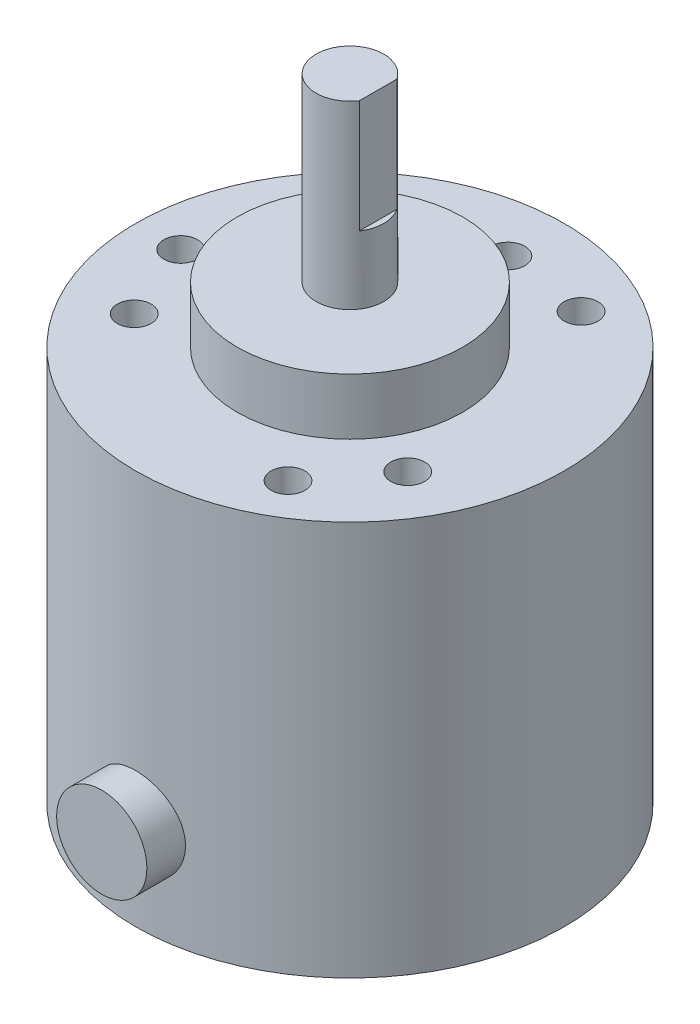
ISO-10303-21;
HEADER;
FILE_DESCRIPTION(('STEP AP214'),'2;1');
FILE_NAME('part.step','',(''),(''),'','','');
FILE_SCHEMA(('AUTOMOTIVE_DESIGN { 1 0 10303 214 1 1 1 1 }'));
ENDSEC;
DATA;
#1=APPLICATION_CONTEXT('core data for automotive mechanical design processes');
#2=APPLICATION_PROTOCOL_DEFINITION('international standard','automotive_design',2000,#1);
#3=PRODUCT_CONTEXT('',#1,'mechanical');
#4=PRODUCT('Part','Part','',(#3));
#5=PRODUCT_RELATED_PRODUCT_CATEGORY('part','',(#4));
#6=PRODUCT_DEFINITION_FORMATION('','',#4);
#7=PRODUCT_DEFINITION_CONTEXT('part definition',#1,'design');
#8=PRODUCT_DEFINITION('design','',#6,#7);
#9=PRODUCT_DEFINITION_SHAPE('','',#8);
#10=(LENGTH_UNIT() NAMED_UNIT(*) SI_UNIT(.MILLI.,.METRE.));
#11=(NAMED_UNIT(*) PLANE_ANGLE_UNIT() SI_UNIT($,.RADIAN.));
#12=(NAMED_UNIT(*) SI_UNIT($,.STERADIAN.) SOLID_ANGLE_UNIT());
#13=UNCERTAINTY_MEASURE_WITH_UNIT(LENGTH_MEASURE(1.E-05),#10,'distance_accuracy_value','');
#14=(GEOMETRIC_REPRESENTATION_CONTEXT(3) GLOBAL_UNCERTAINTY_ASSIGNED_CONTEXT((#13)) GLOBAL_UNIT_ASSIGNED_CONTEXT((#10,
#11,#12)) REPRESENTATION_CONTEXT('',''));
#15=CARTESIAN_POINT('',(0.,0.,0.));
#16=DIRECTION('',(0.,0.,1.));
#17=DIRECTION('',(1.,0.,0.));
#18=AXIS2_PLACEMENT_3D('',#15,#16,#17);
#19=CARTESIAN_POINT('',(0.,-35.,0.));
#20=DIRECTION('',(0.,1.,0.));
#21=DIRECTION('',(0.,0.,1.));
#22=AXIS2_PLACEMENT_3D('',#19,#20,#21);
#23=CYLINDRICAL_SURFACE('',#22,19.);
#24=CARTESIAN_POINT('',(0.,0.,0.));
#25=DIRECTION('',(0.,1.,0.));
#26=DIRECTION('',(0.,0.,1.));
#27=AXIS2_PLACEMENT_3D('',#24,#25,#26);
#28=CIRCLE('',#27,19.);
#29=CARTESIAN_POINT('',(0.,0.,19.));
#30=VERTEX_POINT('',#29);
#31=EDGE_CURVE('E100',#30,#30,#28,.T.);
#32=ORIENTED_EDGE('',*,*,#31,.F.);
#33=EDGE_LOOP('',(#32));
#34=FACE_BOUND('',#33,.T.);
#35=CARTESIAN_POINT('',(0.,-35.,0.));
#36=DIRECTION('',(0.,1.,0.));
#37=DIRECTION('',(0.,0.,1.));
#38=AXIS2_PLACEMENT_3D('',#35,#36,#37);
#39=CIRCLE('',#38,19.);
#40=CARTESIAN_POINT('',(0.,-35.,19.));
#41=VERTEX_POINT('',#40);
#42=EDGE_CURVE('E111',#41,#41,#39,.T.);
#43=ORIENTED_EDGE('',*,*,#42,.T.);
#44=EDGE_LOOP('',(#43));
#45=FACE_BOUND('',#44,.T.);
#46=CARTESIAN_POINT('',(0.,-31.,19.));
#47=CARTESIAN_POINT('',(-0.222055382813836,-30.9999921424837,18.9999958893257));
#48=CARTESIAN_POINT('',(-0.444207639395813,-30.9814468251699,18.996067480223));
#49=CARTESIAN_POINT('',(-0.882215795355482,-30.9078244315504,18.9807754775309));
#50=CARTESIAN_POINT('',(-1.09806684309606,-30.8527199425833,18.9694063048226));
#51=CARTESIAN_POINT('',(-1.51707790871326,-30.7077706493815,18.9405002887392));
#52=CARTESIAN_POINT('',(-1.72025045450495,-30.6179607904962,18.9229696510356));
#53=CARTESIAN_POINT('',(-2.10863339112694,-30.4062579201912,18.8836388783474));
#54=CARTESIAN_POINT('',(-2.29384451534851,-30.2843662194756,18.8618389177952));
#55=CARTESIAN_POINT('',(-2.64382211329557,-30.0100326328436,18.8159987980037));
#56=CARTESIAN_POINT('',(-2.80828196955391,-29.8572039029418,18.7919325734539));
#57=CARTESIAN_POINT('',(-3.10943160183122,-29.5261654962331,18.7444586505301));
#58=CARTESIAN_POINT('',(-3.2461190435998,-29.3479536881373,18.7210510076518));
#59=CARTESIAN_POINT('',(-3.48917522663028,-28.9689683719067,18.6772887116273));
#60=CARTESIAN_POINT('',(-3.59522154866623,-28.7679838775135,18.6569675220811));
#61=CARTESIAN_POINT('',(-3.77191825818649,-28.3505496030705,18.6220513911507));
#62=CARTESIAN_POINT('',(-3.84257254527847,-28.1341015298517,18.607455818938));
#63=CARTESIAN_POINT('',(-3.94547423596825,-27.6951983758734,18.5859082009251));
#64=CARTESIAN_POINT('',(-3.97826234299207,-27.4728754520748,18.5788486590822));
#65=CARTESIAN_POINT('',(-4.00618140253168,-27.0257808194625,18.5728492573137));
#66=CARTESIAN_POINT('',(-4.00131663256248,-26.8010093917057,18.5739084750649));
#67=CARTESIAN_POINT('',(-3.95450406930534,-26.3593890862353,18.583929433905));
#68=CARTESIAN_POINT('',(-3.91318065931278,-26.1424705490151,18.5927581103508));
#69=CARTESIAN_POINT('',(-3.79561141204452,-25.718715573759,18.6171132262784));
#70=CARTESIAN_POINT('',(-3.7193637454707,-25.5118796644692,18.6326400165983));
#71=CARTESIAN_POINT('',(-3.53352685048917,-25.1123862317378,18.6687752085924));
#72=CARTESIAN_POINT('',(-3.42369423166177,-24.9198454034266,18.6894204901852));
#73=CARTESIAN_POINT('',(-3.17397657448484,-24.5556944147395,18.7334433759803));
#74=CARTESIAN_POINT('',(-3.03408772641144,-24.3840869120572,18.7568213263859));
#75=CARTESIAN_POINT('',(-2.72490638537109,-24.0630754365034,18.8042488683663));
#76=CARTESIAN_POINT('',(-2.55508206157721,-23.9141838274458,18.8283025447517));
#77=CARTESIAN_POINT('',(-2.19260701237293,-23.6469149885702,18.873944715442));
#78=CARTESIAN_POINT('',(-1.99995593040768,-23.528538235487,18.8955331712296));
#79=CARTESIAN_POINT('',(-1.59669589320591,-23.3255471413451,18.9338746434493));
#80=CARTESIAN_POINT('',(-1.38605416097403,-23.2409960909265,18.9506185793451));
#81=CARTESIAN_POINT('',(-0.953123444845402,-23.1086282233457,18.9773163519414));
#82=CARTESIAN_POINT('',(-0.730836031740074,-23.0608064656238,18.987271101854));
#83=CARTESIAN_POINT('',(-0.285322358287668,-23.0039909872077,18.9991401442735));
#84=CARTESIAN_POINT('',(-0.0621891762186728,-22.9942968056736,19.0011994695835));
#85=CARTESIAN_POINT('',(0.382508336009774,-23.0121185393307,18.997450449021));
#86=CARTESIAN_POINT('',(0.604072763492887,-23.0396321254991,18.9916425955951));
#87=CARTESIAN_POINT('',(1.03704990387805,-23.1305070081485,18.9729029753973));
#88=CARTESIAN_POINT('',(1.24854238337961,-23.1935044862496,18.9600435437171));
#89=CARTESIAN_POINT('',(1.65796032712833,-23.353157872429,18.9286386979287));
#90=CARTESIAN_POINT('',(1.8558846943375,-23.4498164983177,18.91009282471));
#91=CARTESIAN_POINT('',(2.23547042782498,-23.6755328256164,18.869012787005));
#92=CARTESIAN_POINT('',(2.41687884164439,-23.8050066120728,18.8464285922688));
#93=CARTESIAN_POINT('',(2.75564561874648,-24.0921259709389,18.799885845297));
#94=CARTESIAN_POINT('',(2.91300109975833,-24.2497749146847,18.7759271288244));
#95=CARTESIAN_POINT('',(3.201935237809,-24.5919727155078,18.7288400533491));
#96=CARTESIAN_POINT('',(3.33303066599124,-24.7769329971137,18.7057327105623));
#97=CARTESIAN_POINT('',(3.5622974306445,-25.1666584386008,18.6634317231936));
#98=CARTESIAN_POINT('',(3.66047015053673,-25.3714227658445,18.6442379141773));
#99=CARTESIAN_POINT('',(3.82046809790262,-25.7938700942725,18.6121113785543));
#100=CARTESIAN_POINT('',(3.88249139206334,-26.0114753643481,18.5991446035873));
#101=CARTESIAN_POINT('',(3.96901995121824,-26.4543246385849,18.5808738151247));
#102=CARTESIAN_POINT('',(3.99353071271758,-26.6795675187044,18.5755686790177));
#103=CARTESIAN_POINT('',(4.00411803678917,-27.1264354540013,18.5732888386761));
#104=CARTESIAN_POINT('',(3.99095955808213,-27.3480418873506,18.576148330205));
#105=CARTESIAN_POINT('',(3.92828225656662,-27.7858051398868,18.589502601972));
#106=CARTESIAN_POINT('',(3.87876379872269,-28.0019620137514,18.5999973055712));
#107=CARTESIAN_POINT('',(3.7451292661544,-28.4221367691109,18.6273616503272));
#108=CARTESIAN_POINT('',(3.66111668433852,-28.6261888903993,18.6442122097795));
#109=CARTESIAN_POINT('',(3.46097067460855,-29.0174180661529,18.6823985618686));
#110=CARTESIAN_POINT('',(3.34483418824594,-29.2045935115748,18.7037347815292));
#111=CARTESIAN_POINT('',(3.08116600704923,-29.5605443062738,18.7489890956385));
#112=CARTESIAN_POINT('',(2.93308584847833,-29.7289082548408,18.7729481409154));
#113=CARTESIAN_POINT('',(2.61085484825932,-30.0386494217784,18.8204651322459));
#114=CARTESIAN_POINT('',(2.43669800852824,-30.180020414241,18.8440229846262));
#115=CARTESIAN_POINT('',(2.0647779741216,-30.4333539965082,18.8884129022144));
#116=CARTESIAN_POINT('',(1.86675996870868,-30.5449490336213,18.909209437839));
#117=CARTESIAN_POINT('',(1.45438907613669,-30.7330980359579,18.9453803674082));
#118=CARTESIAN_POINT('',(1.24005053974158,-30.8096823805881,18.9607594594965));
#119=CARTESIAN_POINT('',(0.854478514211865,-30.9114533885606,18.981508741389));
#120=CARTESIAN_POINT('',(0.685381801359018,-30.9445969016263,18.9884010859942));
#121=CARTESIAN_POINT('',(0.34420938671229,-30.9888728301902,18.9976482214323));
#122=CARTESIAN_POINT('',(0.172133799582145,-31.0000060910216,19.0000031865293));
#123=CARTESIAN_POINT('',(0.,-31.,19.));
#124=B_SPLINE_CURVE_WITH_KNOTS('',3,(#46,#47,#48,#49,#50,#51,#52,#53,#54,#55,#56,#57,#58,#59,
#60,#61,#62,#63,#64,#65,#66,#67,#68,#69,#70,#71,#72,#73,#74,#75,#76,#77,#78,#79,#80,#81,#82,#83,
#84,#85,#86,#87,#88,#89,#90,#91,#92,#93,#94,#95,#96,#97,#98,#99,#100,#101,#102,#103,#104,#105,
#106,#107,#108,#109,#110,#111,#112,#113,#114,#115,#116,#117,#118,#119,#120,#121,#122,#123),
.UNSPECIFIED.,.T.,.F.,(4,2,2,2,2,2,2,2,2,2,2,2,2,2,2,2,2,2,2,2,2,2,2,2,2,2,2,2,2,2,2,2,2,2,2,2,
2,2,4),(0.,0.665536234062554,1.33157206286139,1.99693899051184,2.66227873880329,3.3365183946508,
4.0108146964097,4.69196738164773,5.37304499878556,6.04427211507891,6.71542297844931,
7.37529822854114,8.03520804620082,8.7000183684136,9.36491300724142,10.0430975373678,
10.7212926621599,11.4007508759998,12.080117678007,12.7469435233153,13.4137276305458,
14.0737964538715,14.7339185836982,15.4028707046387,16.0719029235962,16.7522989553899,
17.4326663931731,18.1092701011708,18.7857746606523,19.4486393151671,20.111497316246,
20.7723809072781,21.4333274412995,22.1066821923303,22.7801920650891,23.4616668159212,
24.1425491112116,24.658482025837,25.1743951249796),.UNSPECIFIED.);
#125=CARTESIAN_POINT('',(0.,-31.,19.));
#126=VERTEX_POINT('',#125);
#127=EDGE_CURVE('E51',#126,#126,#124,.T.);
#128=ORIENTED_EDGE('',*,*,#127,.T.);
#129=EDGE_LOOP('',(#128));
#130=FACE_BOUND('',#129,.T.);
#131=ADVANCED_FACE('F47',(#34,#45,#130),#23,.T.);
#132=CARTESIAN_POINT('',(0.,-35.,0.));
#133=DIRECTION('',(0.,1.,0.));
#134=DIRECTION('',(0.,0.,1.));
#135=AXIS2_PLACEMENT_3D('',#132,#133,#134);
#136=PLANE('',#135);
#137=ORIENTED_EDGE('',*,*,#42,.F.);
#138=EDGE_LOOP('',(#137));
#139=FACE_BOUND('',#138,.T.);
#140=ADVANCED_FACE('F123',(#139),#136,.F.);
#141=CARTESIAN_POINT('',(0.,0.,0.));
#142=DIRECTION('',(0.,1.,0.));
#143=DIRECTION('',(0.,0.,1.));
#144=AXIS2_PLACEMENT_3D('',#141,#142,#143);
#145=PLANE('',#144);
#146=CARTESIAN_POINT('',(7.49999999999988,0.,12.9903810567667));
#147=DIRECTION('',(0.,1.,0.));
#148=DIRECTION('',(0.,0.,1.));
#149=AXIS2_PLACEMENT_3D('',#146,#147,#148);
#150=CIRCLE('',#149,1.5);
#151=CARTESIAN_POINT('',(7.49999999999988,0.,14.4903810567667));
#152=VERTEX_POINT('',#151);
#153=EDGE_CURVE('E135',#152,#152,#150,.T.);
#154=ORIENTED_EDGE('',*,*,#153,.F.);
#155=EDGE_LOOP('',(#154));
#156=FACE_BOUND('',#155,.T.);
#157=CARTESIAN_POINT('',(12.1243556529821,0.,7.));
#158=DIRECTION('',(0.,1.,0.));
#159=DIRECTION('',(0.,0.,1.));
#160=AXIS2_PLACEMENT_3D('',#157,#158,#159);
#161=CIRCLE('',#160,1.50000000000006);
#162=CARTESIAN_POINT('',(12.1243556529821,0.,8.50000000000006));
#163=VERTEX_POINT('',#162);
#164=EDGE_CURVE('E167',#163,#163,#161,.T.);
#165=ORIENTED_EDGE('',*,*,#164,.F.);
#166=EDGE_LOOP('',(#165));
#167=FACE_BOUND('',#166,.T.);
#168=CARTESIAN_POINT('',(7.50000000000006,0.,-12.9903810567665));
#169=DIRECTION('',(0.,1.,0.));
#170=DIRECTION('',(0.,0.,1.));
#171=AXIS2_PLACEMENT_3D('',#168,#169,#170);
#172=CIRCLE('',#171,1.5);
#173=CARTESIAN_POINT('',(7.50000000000006,0.,-11.4903810567665));
#174=VERTEX_POINT('',#173);
#175=EDGE_CURVE('E159',#174,#174,#172,.T.);
#176=ORIENTED_EDGE('',*,*,#175,.F.);
#177=EDGE_LOOP('',(#176));
#178=FACE_BOUND('',#177,.T.);
#179=CARTESIAN_POINT('',(0.,0.,-14.));
#180=DIRECTION('',(0.,1.,0.));
#181=DIRECTION('',(0.,0.,1.));
#182=AXIS2_PLACEMENT_3D('',#179,#180,#181);
#183=CIRCLE('',#182,1.5);
#184=CARTESIAN_POINT('',(0.,0.,-12.5));
#185=VERTEX_POINT('',#184);
#186=EDGE_CURVE('E151',#185,#185,#183,.T.);
#187=ORIENTED_EDGE('',*,*,#186,.F.);
#188=EDGE_LOOP('',(#187));
#189=FACE_BOUND('',#188,.T.);
#190=CARTESIAN_POINT('',(-12.1243556529821,0.,7.00000000000001));
#191=DIRECTION('',(0.,1.,0.));
#192=DIRECTION('',(0.,0.,1.));
#193=AXIS2_PLACEMENT_3D('',#190,#191,#192);
#194=CIRCLE('',#193,1.50000000000013);
#195=CARTESIAN_POINT('',(-12.1243556529821,0.,8.50000000000014));
#196=VERTEX_POINT('',#195);
#197=EDGE_CURVE('E142',#196,#196,#194,.T.);
#198=ORIENTED_EDGE('',*,*,#197,.F.);
#199=EDGE_LOOP('',(#198));
#200=FACE_BOUND('',#199,.T.);
#201=CARTESIAN_POINT('',(-15.,0.,0.));
#202=DIRECTION('',(0.,1.,0.));
#203=DIRECTION('',(0.,0.,1.));
#204=AXIS2_PLACEMENT_3D('',#201,#202,#203);
#205=CIRCLE('',#204,1.5);
#206=CARTESIAN_POINT('',(-15.,0.,1.5));
#207=VERTEX_POINT('',#206);
#208=EDGE_CURVE('E146',#207,#207,#205,.T.);
#209=ORIENTED_EDGE('',*,*,#208,.F.);
#210=EDGE_LOOP('',(#209));
#211=FACE_BOUND('',#210,.T.);
#212=CARTESIAN_POINT('',(0.,0.,0.));
#213=DIRECTION('',(0.,1.,0.));
#214=DIRECTION('',(0.,0.,1.));
#215=AXIS2_PLACEMENT_3D('',#212,#213,#214);
#216=CIRCLE('',#215,10.);
#217=CARTESIAN_POINT('',(0.,0.,10.));
#218=VERTEX_POINT('',#217);
#219=EDGE_CURVE('E106',#218,#218,#216,.T.);
#220=ORIENTED_EDGE('',*,*,#219,.F.);
#221=EDGE_LOOP('',(#220));
#222=FACE_BOUND('',#221,.T.);
#223=ORIENTED_EDGE('',*,*,#31,.T.);
#224=EDGE_LOOP('',(#223));
#225=FACE_BOUND('',#224,.T.);
#226=ADVANCED_FACE('F119',(#156,#167,#178,#189,#200,#211,#222,#225),#145,.T.);
#227=CARTESIAN_POINT('',(0.,5.,0.));
#228=DIRECTION('',(0.,-1.,0.));
#229=DIRECTION('',(0.,0.,-1.));
#230=AXIS2_PLACEMENT_3D('',#227,#228,#229);
#231=CYLINDRICAL_SURFACE('',#230,10.);
#232=CARTESIAN_POINT('',(0.,5.,0.));
#233=DIRECTION('',(0.,1.,0.));
#234=DIRECTION('',(0.,0.,1.));
#235=AXIS2_PLACEMENT_3D('',#232,#233,#234);
#236=CIRCLE('',#235,10.);
#237=CARTESIAN_POINT('',(0.,5.,10.));
#238=VERTEX_POINT('',#237);
#239=EDGE_CURVE('E95',#238,#238,#236,.T.);
#240=ORIENTED_EDGE('',*,*,#239,.F.);
#241=EDGE_LOOP('',(#240));
#242=FACE_BOUND('',#241,.T.);
#243=ORIENTED_EDGE('',*,*,#219,.T.);
#244=EDGE_LOOP('',(#243));
#245=FACE_BOUND('',#244,.T.);
#246=ADVANCED_FACE('F205',(#242,#245),#231,.T.);
#247=CARTESIAN_POINT('',(0.,5.,0.));
#248=DIRECTION('',(0.,1.,0.));
#249=DIRECTION('',(0.,0.,1.));
#250=AXIS2_PLACEMENT_3D('',#247,#248,#249);
#251=PLANE('',#250);
#252=CARTESIAN_POINT('',(0.,5.,0.));
#253=DIRECTION('',(0.,1.,0.));
#254=DIRECTION('',(0.,0.,1.));
#255=AXIS2_PLACEMENT_3D('',#252,#253,#254);
#256=CIRCLE('',#255,3.);
#257=CARTESIAN_POINT('',(0.,5.,3.));
#258=VERTEX_POINT('',#257);
#259=EDGE_CURVE('E85',#258,#258,#256,.T.);
#260=ORIENTED_EDGE('',*,*,#259,.F.);
#261=EDGE_LOOP('',(#260));
#262=FACE_BOUND('',#261,.T.);
#263=ORIENTED_EDGE('',*,*,#239,.T.);
#264=EDGE_LOOP('',(#263));
#265=FACE_BOUND('',#264,.T.);
#266=ADVANCED_FACE('F202',(#262,#265),#251,.T.);
#267=CARTESIAN_POINT('',(0.,21.,0.));
#268=DIRECTION('',(0.,-1.,0.));
#269=DIRECTION('',(0.,0.,-1.));
#270=AXIS2_PLACEMENT_3D('',#267,#268,#269);
#271=CYLINDRICAL_SURFACE('',#270,3.);
#272=CARTESIAN_POINT('',(0.,21.,0.));
#273=DIRECTION('',(0.,1.,0.));
#274=DIRECTION('',(0.,0.,1.));
#275=AXIS2_PLACEMENT_3D('',#272,#273,#274);
#276=CIRCLE('',#275,3.);
#277=CARTESIAN_POINT('',(2.5,21.,-1.6583123951777));
#278=VERTEX_POINT('',#277);
#279=CARTESIAN_POINT('',(2.5,21.,1.6583123951777));
#280=VERTEX_POINT('',#279);
#281=EDGE_CURVE('E89',#278,#280,#276,.T.);
#282=ORIENTED_EDGE('',*,*,#281,.F.);
#283=DIRECTION('',(0.,-1.,0.));
#284=VECTOR('',#283,1.);
#285=CARTESIAN_POINT('',(2.5,21.,-1.6583123951777));
#286=LINE('',#285,#284);
#287=CARTESIAN_POINT('',(2.5,11.,-1.6583123951777));
#288=VERTEX_POINT('',#287);
#289=EDGE_CURVE('E68',#278,#288,#286,.T.);
#290=ORIENTED_EDGE('',*,*,#289,.T.);
#291=CARTESIAN_POINT('',(0.,11.,0.));
#292=DIRECTION('',(0.,1.,0.));
#293=DIRECTION('',(0.,0.,1.));
#294=AXIS2_PLACEMENT_3D('',#291,#292,#293);
#295=CIRCLE('',#294,3.);
#296=CARTESIAN_POINT('',(2.5,11.,1.6583123951777));
#297=VERTEX_POINT('',#296);
#298=EDGE_CURVE('E11',#297,#288,#295,.T.);
#299=ORIENTED_EDGE('',*,*,#298,.F.);
#300=DIRECTION('',(0.,-1.,0.));
#301=VECTOR('',#300,1.);
#302=CARTESIAN_POINT('',(2.5,21.,1.6583123951777));
#303=LINE('',#302,#301);
#304=EDGE_CURVE('E79',#297,#280,#303,.F.);
#305=ORIENTED_EDGE('',*,*,#304,.T.);
#306=EDGE_LOOP('',(#282,#290,#299,#305));
#307=FACE_BOUND('',#306,.T.);
#308=ORIENTED_EDGE('',*,*,#259,.T.);
#309=EDGE_LOOP('',(#308));
#310=FACE_BOUND('',#309,.T.);
#311=ADVANCED_FACE('F87',(#307,#310),#271,.T.);
#312=CARTESIAN_POINT('',(0.,21.,0.));
#313=DIRECTION('',(0.,1.,0.));
#314=DIRECTION('',(0.,0.,1.));
#315=AXIS2_PLACEMENT_3D('',#312,#313,#314);
#316=PLANE('',#315);
#317=DIRECTION('',(0.,0.,1.));
#318=VECTOR('',#317,1.);
#319=CARTESIAN_POINT('',(2.5,21.,0.));
#320=LINE('',#319,#318);
#321=EDGE_CURVE('E61',#278,#280,#320,.T.);
#322=ORIENTED_EDGE('',*,*,#321,.F.);
#323=ORIENTED_EDGE('',*,*,#281,.T.);
#324=EDGE_LOOP('',(#322,#323));
#325=FACE_BOUND('',#324,.T.);
#326=ADVANCED_FACE('F93',(#325),#316,.T.);
#327=CARTESIAN_POINT('',(0.,11.,0.));
#328=DIRECTION('',(0.,1.,0.));
#329=DIRECTION('',(0.,0.,1.));
#330=AXIS2_PLACEMENT_3D('',#327,#328,#329);
#331=PLANE('',#330);
#332=DIRECTION('',(0.,0.,1.));
#333=VECTOR('',#332,1.);
#334=CARTESIAN_POINT('',(2.5,11.,3.14137603579649));
#335=LINE('',#334,#333);
#336=EDGE_CURVE('E91',#288,#297,#335,.T.);
#337=ORIENTED_EDGE('',*,*,#336,.T.);
#338=ORIENTED_EDGE('',*,*,#298,.T.);
#339=EDGE_LOOP('',(#337,#338));
#340=FACE_BOUND('',#339,.T.);
#341=ADVANCED_FACE('F187',(#340),#331,.T.);
#342=CARTESIAN_POINT('',(2.5,11.,3.14137603579649));
#343=DIRECTION('',(-1.,0.,0.));
#344=DIRECTION('',(0.,0.,1.));
#345=AXIS2_PLACEMENT_3D('',#342,#343,#344);
#346=PLANE('',#345);
#347=ORIENTED_EDGE('',*,*,#321,.T.);
#348=ORIENTED_EDGE('',*,*,#304,.F.);
#349=ORIENTED_EDGE('',*,*,#336,.F.);
#350=ORIENTED_EDGE('',*,*,#289,.F.);
#351=EDGE_LOOP('',(#347,#348,#349,#350));
#352=FACE_BOUND('',#351,.T.);
#353=ADVANCED_FACE('F78',(#352),#346,.F.);
#354=CARTESIAN_POINT('',(-15.,-7.,0.));
#355=DIRECTION('',(0.,1.,0.));
#356=DIRECTION('',(0.,0.,1.));
#357=AXIS2_PLACEMENT_3D('',#354,#355,#356);
#358=CYLINDRICAL_SURFACE('',#357,1.5);
#359=CARTESIAN_POINT('',(-15.,-7.,0.));
#360=DIRECTION('',(0.,1.,0.));
#361=DIRECTION('',(0.,0.,1.));
#362=AXIS2_PLACEMENT_3D('',#359,#360,#361);
#363=CIRCLE('',#362,1.5);
#364=CARTESIAN_POINT('',(-15.,-7.,1.5));
#365=VERTEX_POINT('',#364);
#366=EDGE_CURVE('E178',#365,#365,#363,.T.);
#367=ORIENTED_EDGE('',*,*,#366,.F.);
#368=EDGE_LOOP('',(#367));
#369=FACE_BOUND('',#368,.T.);
#370=ORIENTED_EDGE('',*,*,#208,.T.);
#371=EDGE_LOOP('',(#370));
#372=FACE_BOUND('',#371,.T.);
#373=ADVANCED_FACE('F194',(#369,#372),#358,.F.);
#374=CARTESIAN_POINT('',(-15.,-7.,0.));
#375=DIRECTION('',(0.,1.,0.));
#376=DIRECTION('',(0.,0.,1.));
#377=AXIS2_PLACEMENT_3D('',#374,#375,#376);
#378=PLANE('',#377);
#379=ORIENTED_EDGE('',*,*,#366,.T.);
#380=EDGE_LOOP('',(#379));
#381=FACE_BOUND('',#380,.T.);
#382=ADVANCED_FACE('F232',(#381),#378,.T.);
#383=CARTESIAN_POINT('',(-12.1243556529821,-7.,7.00000000000001));
#384=DIRECTION('',(0.,1.,0.));
#385=DIRECTION('',(0.,0.,1.));
#386=AXIS2_PLACEMENT_3D('',#383,#384,#385);
#387=CYLINDRICAL_SURFACE('',#386,1.50000000000013);
#388=CARTESIAN_POINT('',(-12.1243556529821,-7.,7.00000000000001));
#389=DIRECTION('',(0.,1.,0.));
#390=DIRECTION('',(0.,0.,1.));
#391=AXIS2_PLACEMENT_3D('',#388,#389,#390);
#392=CIRCLE('',#391,1.50000000000013);
#393=CARTESIAN_POINT('',(-12.1243556529821,-7.,8.50000000000014));
#394=VERTEX_POINT('',#393);
#395=EDGE_CURVE('E147',#394,#394,#392,.T.);
#396=ORIENTED_EDGE('',*,*,#395,.F.);
#397=EDGE_LOOP('',(#396));
#398=FACE_BOUND('',#397,.T.);
#399=ORIENTED_EDGE('',*,*,#197,.T.);
#400=EDGE_LOOP('',(#399));
#401=FACE_BOUND('',#400,.T.);
#402=ADVANCED_FACE('F237',(#398,#401),#387,.F.);
#403=CARTESIAN_POINT('',(-12.1243556529821,-7.,7.00000000000001));
#404=DIRECTION('',(0.,1.,0.));
#405=DIRECTION('',(0.,0.,1.));
#406=AXIS2_PLACEMENT_3D('',#403,#404,#405);
#407=PLANE('',#406);
#408=ORIENTED_EDGE('',*,*,#395,.T.);
#409=EDGE_LOOP('',(#408));
#410=FACE_BOUND('',#409,.T.);
#411=ADVANCED_FACE('F243',(#410),#407,.T.);
#412=CARTESIAN_POINT('',(0.,-7.,-14.));
#413=DIRECTION('',(0.,1.,0.));
#414=DIRECTION('',(0.,0.,1.));
#415=AXIS2_PLACEMENT_3D('',#412,#413,#414);
#416=CYLINDRICAL_SURFACE('',#415,1.5);
#417=CARTESIAN_POINT('',(0.,-7.,-14.));
#418=DIRECTION('',(0.,1.,0.));
#419=DIRECTION('',(0.,0.,1.));
#420=AXIS2_PLACEMENT_3D('',#417,#418,#419);
#421=CIRCLE('',#420,1.5);
#422=CARTESIAN_POINT('',(0.,-7.,-12.5));
#423=VERTEX_POINT('',#422);
#424=EDGE_CURVE('E155',#423,#423,#421,.T.);
#425=ORIENTED_EDGE('',*,*,#424,.F.);
#426=EDGE_LOOP('',(#425));
#427=FACE_BOUND('',#426,.T.);
#428=ORIENTED_EDGE('',*,*,#186,.T.);
#429=EDGE_LOOP('',(#428));
#430=FACE_BOUND('',#429,.T.);
#431=ADVANCED_FACE('F275',(#427,#430),#416,.F.);
#432=CARTESIAN_POINT('',(0.,-7.,-14.));
#433=DIRECTION('',(0.,1.,0.));
#434=DIRECTION('',(0.,0.,1.));
#435=AXIS2_PLACEMENT_3D('',#432,#433,#434);
#436=PLANE('',#435);
#437=ORIENTED_EDGE('',*,*,#424,.T.);
#438=EDGE_LOOP('',(#437));
#439=FACE_BOUND('',#438,.T.);
#440=ADVANCED_FACE('F271',(#439),#436,.T.);
#441=CARTESIAN_POINT('',(7.50000000000006,-7.,-12.9903810567665));
#442=DIRECTION('',(0.,1.,0.));
#443=DIRECTION('',(0.,0.,1.));
#444=AXIS2_PLACEMENT_3D('',#441,#442,#443);
#445=CYLINDRICAL_SURFACE('',#444,1.5);
#446=CARTESIAN_POINT('',(7.50000000000006,-7.,-12.9903810567665));
#447=DIRECTION('',(0.,1.,0.));
#448=DIRECTION('',(0.,0.,1.));
#449=AXIS2_PLACEMENT_3D('',#446,#447,#448);
#450=CIRCLE('',#449,1.5);
#451=CARTESIAN_POINT('',(7.50000000000006,-7.,-11.4903810567665));
#452=VERTEX_POINT('',#451);
#453=EDGE_CURVE('E163',#452,#452,#450,.T.);
#454=ORIENTED_EDGE('',*,*,#453,.F.);
#455=EDGE_LOOP('',(#454));
#456=FACE_BOUND('',#455,.T.);
#457=ORIENTED_EDGE('',*,*,#175,.T.);
#458=EDGE_LOOP('',(#457));
#459=FACE_BOUND('',#458,.T.);
#460=ADVANCED_FACE('F267',(#456,#459),#445,.F.);
#461=CARTESIAN_POINT('',(7.50000000000006,-7.,-12.9903810567665));
#462=DIRECTION('',(0.,1.,0.));
#463=DIRECTION('',(0.,0.,1.));
#464=AXIS2_PLACEMENT_3D('',#461,#462,#463);
#465=PLANE('',#464);
#466=ORIENTED_EDGE('',*,*,#453,.T.);
#467=EDGE_LOOP('',(#466));
#468=FACE_BOUND('',#467,.T.);
#469=ADVANCED_FACE('F263',(#468),#465,.T.);
#470=CARTESIAN_POINT('',(12.1243556529821,-7.,7.));
#471=DIRECTION('',(0.,1.,0.));
#472=DIRECTION('',(0.,0.,1.));
#473=AXIS2_PLACEMENT_3D('',#470,#471,#472);
#474=CYLINDRICAL_SURFACE('',#473,1.50000000000006);
#475=CARTESIAN_POINT('',(12.1243556529821,-7.,7.));
#476=DIRECTION('',(0.,1.,0.));
#477=DIRECTION('',(0.,0.,1.));
#478=AXIS2_PLACEMENT_3D('',#475,#476,#477);
#479=CIRCLE('',#478,1.50000000000006);
#480=CARTESIAN_POINT('',(12.1243556529821,-7.,8.50000000000006));
#481=VERTEX_POINT('',#480);
#482=EDGE_CURVE('E171',#481,#481,#479,.T.);
#483=ORIENTED_EDGE('',*,*,#482,.F.);
#484=EDGE_LOOP('',(#483));
#485=FACE_BOUND('',#484,.T.);
#486=ORIENTED_EDGE('',*,*,#164,.T.);
#487=EDGE_LOOP('',(#486));
#488=FACE_BOUND('',#487,.T.);
#489=ADVANCED_FACE('F259',(#485,#488),#474,.F.);
#490=CARTESIAN_POINT('',(12.1243556529821,-7.,7.));
#491=DIRECTION('',(0.,1.,0.));
#492=DIRECTION('',(0.,0.,1.));
#493=AXIS2_PLACEMENT_3D('',#490,#491,#492);
#494=PLANE('',#493);
#495=ORIENTED_EDGE('',*,*,#482,.T.);
#496=EDGE_LOOP('',(#495));
#497=FACE_BOUND('',#496,.T.);
#498=ADVANCED_FACE('F255',(#497),#494,.T.);
#499=CARTESIAN_POINT('',(7.49999999999988,-7.,12.9903810567667));
#500=DIRECTION('',(0.,1.,0.));
#501=DIRECTION('',(0.,0.,1.));
#502=AXIS2_PLACEMENT_3D('',#499,#500,#501);
#503=CYLINDRICAL_SURFACE('',#502,1.5);
#504=CARTESIAN_POINT('',(7.49999999999988,-7.,12.9903810567667));
#505=DIRECTION('',(0.,1.,0.));
#506=DIRECTION('',(0.,0.,1.));
#507=AXIS2_PLACEMENT_3D('',#504,#505,#506);
#508=CIRCLE('',#507,1.5);
#509=CARTESIAN_POINT('',(7.49999999999988,-7.,14.4903810567667));
#510=VERTEX_POINT('',#509);
#511=EDGE_CURVE('E130',#510,#510,#508,.T.);
#512=ORIENTED_EDGE('',*,*,#511,.F.);
#513=EDGE_LOOP('',(#512));
#514=FACE_BOUND('',#513,.T.);
#515=ORIENTED_EDGE('',*,*,#153,.T.);
#516=EDGE_LOOP('',(#515));
#517=FACE_BOUND('',#516,.T.);
#518=ADVANCED_FACE('F251',(#514,#517),#503,.F.);
#519=CARTESIAN_POINT('',(7.49999999999988,-7.,12.9903810567667));
#520=DIRECTION('',(0.,1.,0.));
#521=DIRECTION('',(0.,0.,1.));
#522=AXIS2_PLACEMENT_3D('',#519,#520,#521);
#523=PLANE('',#522);
#524=ORIENTED_EDGE('',*,*,#511,.T.);
#525=EDGE_LOOP('',(#524));
#526=FACE_BOUND('',#525,.T.);
#527=ADVANCED_FACE('F247',(#526),#523,.T.);
#528=CARTESIAN_POINT('',(0.,-27.,22.));
#529=DIRECTION('',(0.,0.,-1.));
#530=DIRECTION('',(-1.,0.,0.));
#531=AXIS2_PLACEMENT_3D('',#528,#529,#530);
#532=CYLINDRICAL_SURFACE('',#531,4.);
#533=ORIENTED_EDGE('',*,*,#127,.F.);
#534=EDGE_LOOP('',(#533));
#535=FACE_BOUND('',#534,.T.);
#536=CARTESIAN_POINT('',(0.,-27.,22.));
#537=DIRECTION('',(0.,0.,1.));
#538=DIRECTION('',(1.,0.,0.));
#539=AXIS2_PLACEMENT_3D('',#536,#537,#538);
#540=CIRCLE('',#539,4.);
#541=CARTESIAN_POINT('',(4.,-27.,22.));
#542=VERTEX_POINT('',#541);
#543=EDGE_CURVE('E131',#542,#542,#540,.T.);
#544=ORIENTED_EDGE('',*,*,#543,.F.);
#545=EDGE_LOOP('',(#544));
#546=FACE_BOUND('',#545,.T.);
#547=ADVANCED_FACE('F250',(#535,#546),#532,.T.);
#548=CARTESIAN_POINT('',(0.,-27.,22.));
#549=DIRECTION('',(0.,0.,1.));
#550=DIRECTION('',(1.,0.,0.));
#551=AXIS2_PLACEMENT_3D('',#548,#549,#550);
#552=PLANE('',#551);
#553=ORIENTED_EDGE('',*,*,#543,.T.);
#554=EDGE_LOOP('',(#553));
#555=FACE_BOUND('',#554,.T.);
#556=ADVANCED_FACE('F285',(#555),#552,.T.);
#557=CLOSED_SHELL('',(#131,#140,#226,#246,#266,#311,#326,#341,#353,#373,#382,#402,#411,#431,
#440,#460,#469,#489,#498,#518,#527,#547,#556));
#558=MANIFOLD_SOLID_BREP('B2',#557);
#559=ADVANCED_BREP_SHAPE_REPRESENTATION('',(#18,#558),#14);
#560=SHAPE_DEFINITION_REPRESENTATION(#9,#559);
ENDSEC;
END-ISO-10303-21;
